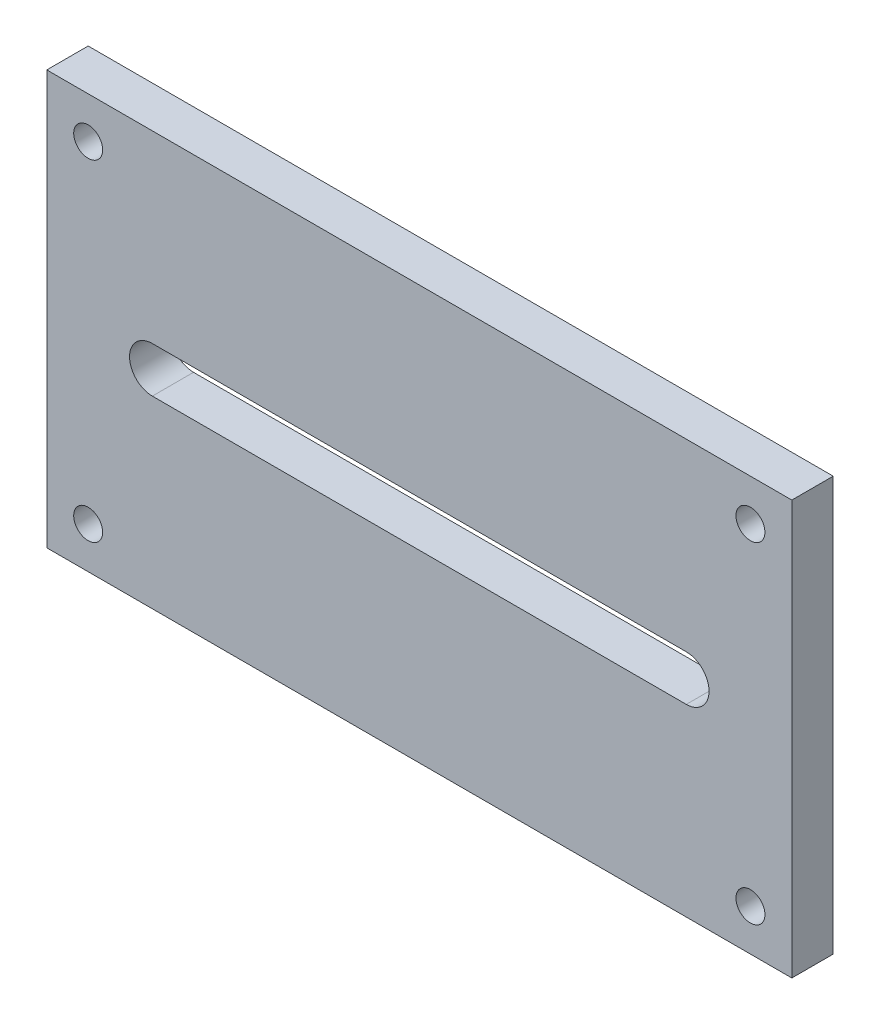
ISO-10303-21;
HEADER;
FILE_DESCRIPTION(('STEP AP214'),'2;1');
FILE_NAME('part.step','',(''),(''),'','','');
FILE_SCHEMA(('AUTOMOTIVE_DESIGN { 1 0 10303 214 1 1 1 1 }'));
ENDSEC;
DATA;
#1=APPLICATION_CONTEXT('core data for automotive mechanical design processes');
#2=APPLICATION_PROTOCOL_DEFINITION('international standard','automotive_design',2000,#1);
#3=PRODUCT_CONTEXT('',#1,'mechanical');
#4=PRODUCT('Part','Part','',(#3));
#5=PRODUCT_RELATED_PRODUCT_CATEGORY('part','',(#4));
#6=PRODUCT_DEFINITION_FORMATION('','',#4);
#7=PRODUCT_DEFINITION_CONTEXT('part definition',#1,'design');
#8=PRODUCT_DEFINITION('design','',#6,#7);
#9=PRODUCT_DEFINITION_SHAPE('','',#8);
#10=(LENGTH_UNIT() NAMED_UNIT(*) SI_UNIT(.MILLI.,.METRE.));
#11=(NAMED_UNIT(*) PLANE_ANGLE_UNIT() SI_UNIT($,.RADIAN.));
#12=(NAMED_UNIT(*) SI_UNIT($,.STERADIAN.) SOLID_ANGLE_UNIT());
#13=UNCERTAINTY_MEASURE_WITH_UNIT(LENGTH_MEASURE(1.E-05),#10,'distance_accuracy_value','');
#14=(GEOMETRIC_REPRESENTATION_CONTEXT(3) GLOBAL_UNCERTAINTY_ASSIGNED_CONTEXT((#13)) GLOBAL_UNIT_ASSIGNED_CONTEXT((#10,
#11,#12)) REPRESENTATION_CONTEXT('',''));
#15=CARTESIAN_POINT('',(0.,0.,0.));
#16=DIRECTION('',(0.,0.,1.));
#17=DIRECTION('',(1.,0.,0.));
#18=AXIS2_PLACEMENT_3D('',#15,#16,#17);
#19=CARTESIAN_POINT('',(45.,25.,5.));
#20=DIRECTION('',(-1.,0.,0.));
#21=DIRECTION('',(0.,-1.,0.));
#22=AXIS2_PLACEMENT_3D('',#19,#20,#21);
#23=PLANE('',#22);
#24=DIRECTION('',(0.,1.,0.));
#25=VECTOR('',#24,1.);
#26=CARTESIAN_POINT('',(45.,25.,0.));
#27=LINE('',#26,#25);
#28=CARTESIAN_POINT('',(45.,-25.,0.));
#29=VERTEX_POINT('',#28);
#30=CARTESIAN_POINT('',(45.,25.,0.));
#31=VERTEX_POINT('',#30);
#32=EDGE_CURVE('E262',#29,#31,#27,.T.);
#33=ORIENTED_EDGE('',*,*,#32,.T.);
#34=DIRECTION('',(0.,0.,-1.));
#35=VECTOR('',#34,1.);
#36=CARTESIAN_POINT('',(45.,25.,5.));
#37=LINE('',#36,#35);
#38=CARTESIAN_POINT('',(45.,25.,5.));
#39=VERTEX_POINT('',#38);
#40=EDGE_CURVE('E13',#39,#31,#37,.T.);
#41=ORIENTED_EDGE('',*,*,#40,.F.);
#42=DIRECTION('',(0.,1.,0.));
#43=VECTOR('',#42,1.);
#44=CARTESIAN_POINT('',(45.,25.,5.));
#45=LINE('',#44,#43);
#46=CARTESIAN_POINT('',(45.,-25.,5.));
#47=VERTEX_POINT('',#46);
#48=EDGE_CURVE('E263',#47,#39,#45,.T.);
#49=ORIENTED_EDGE('',*,*,#48,.F.);
#50=DIRECTION('',(0.,0.,-1.));
#51=VECTOR('',#50,1.);
#52=CARTESIAN_POINT('',(45.,-25.,5.));
#53=LINE('',#52,#51);
#54=EDGE_CURVE('E277',#47,#29,#53,.T.);
#55=ORIENTED_EDGE('',*,*,#54,.T.);
#56=EDGE_LOOP('',(#33,#41,#49,#55));
#57=FACE_BOUND('',#56,.T.);
#58=ADVANCED_FACE('F119',(#57),#23,.F.);
#59=CARTESIAN_POINT('',(-45.,25.,5.));
#60=DIRECTION('',(0.,-1.,0.));
#61=DIRECTION('',(0.,0.,-1.));
#62=AXIS2_PLACEMENT_3D('',#59,#60,#61);
#63=PLANE('',#62);
#64=DIRECTION('',(-1.,0.,0.));
#65=VECTOR('',#64,1.);
#66=CARTESIAN_POINT('',(-45.,25.,0.));
#67=LINE('',#66,#65);
#68=CARTESIAN_POINT('',(-45.,25.,0.));
#69=VERTEX_POINT('',#68);
#70=EDGE_CURVE('E281',#31,#69,#67,.T.);
#71=ORIENTED_EDGE('',*,*,#70,.T.);
#72=DIRECTION('',(0.,0.,-1.));
#73=VECTOR('',#72,1.);
#74=CARTESIAN_POINT('',(-45.,25.,5.));
#75=LINE('',#74,#73);
#76=CARTESIAN_POINT('',(-45.,25.,5.));
#77=VERTEX_POINT('',#76);
#78=EDGE_CURVE('E127',#77,#69,#75,.T.);
#79=ORIENTED_EDGE('',*,*,#78,.F.);
#80=DIRECTION('',(-1.,0.,0.));
#81=VECTOR('',#80,1.);
#82=CARTESIAN_POINT('',(-45.,25.,5.));
#83=LINE('',#82,#81);
#84=EDGE_CURVE('E267',#39,#77,#83,.T.);
#85=ORIENTED_EDGE('',*,*,#84,.F.);
#86=ORIENTED_EDGE('',*,*,#40,.T.);
#87=EDGE_LOOP('',(#71,#79,#85,#86));
#88=FACE_BOUND('',#87,.T.);
#89=ADVANCED_FACE('F317',(#88),#63,.F.);
#90=CARTESIAN_POINT('',(-45.,25.,5.));
#91=DIRECTION('',(1.,0.,0.));
#92=DIRECTION('',(0.,1.,0.));
#93=AXIS2_PLACEMENT_3D('',#90,#91,#92);
#94=PLANE('',#93);
#95=DIRECTION('',(0.,-1.,0.));
#96=VECTOR('',#95,1.);
#97=CARTESIAN_POINT('',(-45.,25.,0.));
#98=LINE('',#97,#96);
#99=CARTESIAN_POINT('',(-45.,-25.,0.));
#100=VERTEX_POINT('',#99);
#101=EDGE_CURVE('E284',#69,#100,#98,.T.);
#102=ORIENTED_EDGE('',*,*,#101,.T.);
#103=DIRECTION('',(0.,0.,-1.));
#104=VECTOR('',#103,1.);
#105=CARTESIAN_POINT('',(-45.,-25.,5.));
#106=LINE('',#105,#104);
#107=CARTESIAN_POINT('',(-45.,-25.,5.));
#108=VERTEX_POINT('',#107);
#109=EDGE_CURVE('E292',#108,#100,#106,.T.);
#110=ORIENTED_EDGE('',*,*,#109,.F.);
#111=DIRECTION('',(0.,-1.,0.));
#112=VECTOR('',#111,1.);
#113=CARTESIAN_POINT('',(-45.,25.,5.));
#114=LINE('',#113,#112);
#115=EDGE_CURVE('E271',#77,#108,#114,.T.);
#116=ORIENTED_EDGE('',*,*,#115,.F.);
#117=ORIENTED_EDGE('',*,*,#78,.T.);
#118=EDGE_LOOP('',(#102,#110,#116,#117));
#119=FACE_BOUND('',#118,.T.);
#120=ADVANCED_FACE('F301',(#119),#94,.F.);
#121=CARTESIAN_POINT('',(-45.,-25.,5.));
#122=DIRECTION('',(0.,1.,0.));
#123=DIRECTION('',(0.,0.,1.));
#124=AXIS2_PLACEMENT_3D('',#121,#122,#123);
#125=PLANE('',#124);
#126=DIRECTION('',(1.,0.,0.));
#127=VECTOR('',#126,1.);
#128=CARTESIAN_POINT('',(-45.,-25.,0.));
#129=LINE('',#128,#127);
#130=EDGE_CURVE('E268',#100,#29,#129,.T.);
#131=ORIENTED_EDGE('',*,*,#130,.T.);
#132=ORIENTED_EDGE('',*,*,#54,.F.);
#133=DIRECTION('',(1.,0.,0.));
#134=VECTOR('',#133,1.);
#135=CARTESIAN_POINT('',(-45.,-25.,5.));
#136=LINE('',#135,#134);
#137=EDGE_CURVE('E274',#108,#47,#136,.T.);
#138=ORIENTED_EDGE('',*,*,#137,.F.);
#139=ORIENTED_EDGE('',*,*,#109,.T.);
#140=EDGE_LOOP('',(#131,#132,#138,#139));
#141=FACE_BOUND('',#140,.T.);
#142=ADVANCED_FACE('F310',(#141),#125,.F.);
#143=CARTESIAN_POINT('',(0.,0.,5.));
#144=DIRECTION('',(0.,0.,1.));
#145=DIRECTION('',(1.,0.,0.));
#146=AXIS2_PLACEMENT_3D('',#143,#144,#145);
#147=PLANE('',#146);
#148=CARTESIAN_POINT('',(40.,20.,5.));
#149=DIRECTION('',(0.,0.,-1.));
#150=DIRECTION('',(-1.,0.,0.));
#151=AXIS2_PLACEMENT_3D('',#148,#149,#150);
#152=CIRCLE('',#151,1.75);
#153=CARTESIAN_POINT('',(38.25,20.,5.));
#154=VERTEX_POINT('',#153);
#155=EDGE_CURVE('E399',#154,#154,#152,.T.);
#156=ORIENTED_EDGE('',*,*,#155,.T.);
#157=EDGE_LOOP('',(#156));
#158=FACE_BOUND('',#157,.T.);
#159=CARTESIAN_POINT('',(-40.,20.,5.));
#160=DIRECTION('',(0.,0.,-1.));
#161=DIRECTION('',(-1.,0.,0.));
#162=AXIS2_PLACEMENT_3D('',#159,#160,#161);
#163=CIRCLE('',#162,1.75);
#164=CARTESIAN_POINT('',(-41.75,20.,5.));
#165=VERTEX_POINT('',#164);
#166=EDGE_CURVE('E413',#165,#165,#163,.T.);
#167=ORIENTED_EDGE('',*,*,#166,.T.);
#168=EDGE_LOOP('',(#167));
#169=FACE_BOUND('',#168,.T.);
#170=CARTESIAN_POINT('',(-40.,-20.,5.));
#171=DIRECTION('',(0.,0.,-1.));
#172=DIRECTION('',(-1.,0.,0.));
#173=AXIS2_PLACEMENT_3D('',#170,#171,#172);
#174=CIRCLE('',#173,1.75);
#175=CARTESIAN_POINT('',(-41.75,-20.,5.));
#176=VERTEX_POINT('',#175);
#177=EDGE_CURVE('E425',#176,#176,#174,.T.);
#178=ORIENTED_EDGE('',*,*,#177,.T.);
#179=EDGE_LOOP('',(#178));
#180=FACE_BOUND('',#179,.T.);
#181=CARTESIAN_POINT('',(40.,-20.,5.));
#182=DIRECTION('',(0.,0.,-1.));
#183=DIRECTION('',(-1.,0.,0.));
#184=AXIS2_PLACEMENT_3D('',#181,#182,#183);
#185=CIRCLE('',#184,1.75);
#186=CARTESIAN_POINT('',(38.25,-20.,5.));
#187=VERTEX_POINT('',#186);
#188=EDGE_CURVE('E437',#187,#187,#185,.T.);
#189=ORIENTED_EDGE('',*,*,#188,.T.);
#190=EDGE_LOOP('',(#189));
#191=FACE_BOUND('',#190,.T.);
#192=DIRECTION('',(1.,0.,0.));
#193=VECTOR('',#192,1.);
#194=CARTESIAN_POINT('',(-32.25,-2.75,5.));
#195=LINE('',#194,#193);
#196=CARTESIAN_POINT('',(-32.25,-2.75,5.));
#197=VERTEX_POINT('',#196);
#198=CARTESIAN_POINT('',(32.25,-2.75,5.));
#199=VERTEX_POINT('',#198);
#200=EDGE_CURVE('E206',#197,#199,#195,.T.);
#201=ORIENTED_EDGE('',*,*,#200,.F.);
#202=CARTESIAN_POINT('',(-32.25,0.,5.));
#203=DIRECTION('',(0.,0.,-1.));
#204=DIRECTION('',(-1.,0.,0.));
#205=AXIS2_PLACEMENT_3D('',#202,#203,#204);
#206=CIRCLE('',#205,2.75);
#207=CARTESIAN_POINT('',(-32.25,2.75,5.));
#208=VERTEX_POINT('',#207);
#209=EDGE_CURVE('E214',#197,#208,#206,.T.);
#210=ORIENTED_EDGE('',*,*,#209,.T.);
#211=DIRECTION('',(1.,0.,0.));
#212=VECTOR('',#211,1.);
#213=CARTESIAN_POINT('',(-32.25,2.75,5.));
#214=LINE('',#213,#212);
#215=CARTESIAN_POINT('',(32.25,2.75,5.));
#216=VERTEX_POINT('',#215);
#217=EDGE_CURVE('E448',#208,#216,#214,.T.);
#218=ORIENTED_EDGE('',*,*,#217,.T.);
#219=CARTESIAN_POINT('',(32.25,0.,5.));
#220=DIRECTION('',(0.,0.,-1.));
#221=DIRECTION('',(-1.,0.,0.));
#222=AXIS2_PLACEMENT_3D('',#219,#220,#221);
#223=CIRCLE('',#222,2.75);
#224=EDGE_CURVE('E251',#216,#199,#223,.T.);
#225=ORIENTED_EDGE('',*,*,#224,.T.);
#226=EDGE_LOOP('',(#201,#210,#218,#225));
#227=FACE_BOUND('',#226,.T.);
#228=ORIENTED_EDGE('',*,*,#48,.T.);
#229=ORIENTED_EDGE('',*,*,#84,.T.);
#230=ORIENTED_EDGE('',*,*,#115,.T.);
#231=ORIENTED_EDGE('',*,*,#137,.T.);
#232=EDGE_LOOP('',(#228,#229,#230,#231));
#233=FACE_BOUND('',#232,.T.);
#234=ADVANCED_FACE('F316',(#158,#169,#180,#191,#227,#233),#147,.T.);
#235=CARTESIAN_POINT('',(0.,0.,0.));
#236=DIRECTION('',(0.,0.,1.));
#237=DIRECTION('',(1.,0.,0.));
#238=AXIS2_PLACEMENT_3D('',#235,#236,#237);
#239=PLANE('',#238);
#240=CARTESIAN_POINT('',(40.,20.,0.));
#241=DIRECTION('',(0.,0.,-1.));
#242=DIRECTION('',(-1.,0.,0.));
#243=AXIS2_PLACEMENT_3D('',#240,#241,#242);
#244=CIRCLE('',#243,1.775);
#245=CARTESIAN_POINT('',(38.225,20.,0.));
#246=VERTEX_POINT('',#245);
#247=EDGE_CURVE('E395',#246,#246,#244,.T.);
#248=ORIENTED_EDGE('',*,*,#247,.F.);
#249=EDGE_LOOP('',(#248));
#250=FACE_BOUND('',#249,.T.);
#251=CARTESIAN_POINT('',(-40.,20.,0.));
#252=DIRECTION('',(0.,0.,-1.));
#253=DIRECTION('',(-1.,0.,0.));
#254=AXIS2_PLACEMENT_3D('',#251,#252,#253);
#255=CIRCLE('',#254,1.775);
#256=CARTESIAN_POINT('',(-41.775,20.,0.));
#257=VERTEX_POINT('',#256);
#258=EDGE_CURVE('E405',#257,#257,#255,.T.);
#259=ORIENTED_EDGE('',*,*,#258,.F.);
#260=EDGE_LOOP('',(#259));
#261=FACE_BOUND('',#260,.T.);
#262=CARTESIAN_POINT('',(-40.,-20.,0.));
#263=DIRECTION('',(0.,0.,-1.));
#264=DIRECTION('',(-1.,0.,0.));
#265=AXIS2_PLACEMENT_3D('',#262,#263,#264);
#266=CIRCLE('',#265,1.775);
#267=CARTESIAN_POINT('',(-41.775,-20.,0.));
#268=VERTEX_POINT('',#267);
#269=EDGE_CURVE('E417',#268,#268,#266,.T.);
#270=ORIENTED_EDGE('',*,*,#269,.F.);
#271=EDGE_LOOP('',(#270));
#272=FACE_BOUND('',#271,.T.);
#273=CARTESIAN_POINT('',(40.,-20.,0.));
#274=DIRECTION('',(0.,0.,-1.));
#275=DIRECTION('',(-1.,0.,0.));
#276=AXIS2_PLACEMENT_3D('',#273,#274,#275);
#277=CIRCLE('',#276,1.775);
#278=CARTESIAN_POINT('',(38.225,-20.,0.));
#279=VERTEX_POINT('',#278);
#280=EDGE_CURVE('E429',#279,#279,#277,.T.);
#281=ORIENTED_EDGE('',*,*,#280,.F.);
#282=EDGE_LOOP('',(#281));
#283=FACE_BOUND('',#282,.T.);
#284=DIRECTION('',(1.,0.,0.));
#285=VECTOR('',#284,1.);
#286=CARTESIAN_POINT('',(-32.25,-2.775,0.));
#287=LINE('',#286,#285);
#288=CARTESIAN_POINT('',(-32.25,-2.775,0.));
#289=VERTEX_POINT('',#288);
#290=CARTESIAN_POINT('',(32.25,-2.775,0.));
#291=VERTEX_POINT('',#290);
#292=EDGE_CURVE('E205',#289,#291,#287,.T.);
#293=ORIENTED_EDGE('',*,*,#292,.T.);
#294=CARTESIAN_POINT('',(32.25,0.,0.));
#295=DIRECTION('',(0.,0.,-1.));
#296=DIRECTION('',(-1.,0.,0.));
#297=AXIS2_PLACEMENT_3D('',#294,#295,#296);
#298=CIRCLE('',#297,2.775);
#299=CARTESIAN_POINT('',(32.25,2.77500000000003,0.));
#300=VERTEX_POINT('',#299);
#301=EDGE_CURVE('E244',#300,#291,#298,.T.);
#302=ORIENTED_EDGE('',*,*,#301,.F.);
#303=DIRECTION('',(1.,0.,0.));
#304=VECTOR('',#303,1.);
#305=CARTESIAN_POINT('',(-32.25,2.77500000000003,0.));
#306=LINE('',#305,#304);
#307=CARTESIAN_POINT('',(-32.25,2.775,0.));
#308=VERTEX_POINT('',#307);
#309=EDGE_CURVE('E441',#308,#300,#306,.T.);
#310=ORIENTED_EDGE('',*,*,#309,.F.);
#311=CARTESIAN_POINT('',(-32.25,0.,0.));
#312=DIRECTION('',(0.,0.,-1.));
#313=DIRECTION('',(-1.,0.,0.));
#314=AXIS2_PLACEMENT_3D('',#311,#312,#313);
#315=CIRCLE('',#314,2.775);
#316=EDGE_CURVE('E217',#289,#308,#315,.T.);
#317=ORIENTED_EDGE('',*,*,#316,.F.);
#318=EDGE_LOOP('',(#293,#302,#310,#317));
#319=FACE_BOUND('',#318,.T.);
#320=ORIENTED_EDGE('',*,*,#32,.F.);
#321=ORIENTED_EDGE('',*,*,#130,.F.);
#322=ORIENTED_EDGE('',*,*,#101,.F.);
#323=ORIENTED_EDGE('',*,*,#70,.F.);
#324=EDGE_LOOP('',(#320,#321,#322,#323));
#325=FACE_BOUND('',#324,.T.);
#326=ADVANCED_FACE('F307',(#250,#261,#272,#283,#319,#325),#239,.F.);
#327=CARTESIAN_POINT('',(32.25,0.,0.));
#328=DIRECTION('',(0.,0.,-1.));
#329=DIRECTION('',(-1.,0.,0.));
#330=AXIS2_PLACEMENT_3D('',#327,#328,#329);
#331=CYLINDRICAL_SURFACE('',#330,2.75);
#332=ORIENTED_EDGE('',*,*,#224,.F.);
#333=DIRECTION('',(0.,0.,-1.));
#334=VECTOR('',#333,1.);
#335=CARTESIAN_POINT('',(32.25,2.75,0.));
#336=LINE('',#335,#334);
#337=CARTESIAN_POINT('',(32.25,2.75,0.0250000000000014));
#338=VERTEX_POINT('',#337);
#339=EDGE_CURVE('E240',#338,#216,#336,.F.);
#340=ORIENTED_EDGE('',*,*,#339,.F.);
#341=CARTESIAN_POINT('',(32.25,0.,0.0250000000000014));
#342=DIRECTION('',(0.,0.,-1.));
#343=DIRECTION('',(-1.,0.,0.));
#344=AXIS2_PLACEMENT_3D('',#341,#342,#343);
#345=CIRCLE('',#344,2.75);
#346=CARTESIAN_POINT('',(32.25,-2.75,0.0250000000000011));
#347=VERTEX_POINT('',#346);
#348=EDGE_CURVE('E248',#338,#347,#345,.T.);
#349=ORIENTED_EDGE('',*,*,#348,.T.);
#350=DIRECTION('',(0.,0.,-1.));
#351=VECTOR('',#350,1.);
#352=CARTESIAN_POINT('',(32.25,-2.75,0.));
#353=LINE('',#352,#351);
#354=EDGE_CURVE('E134',#199,#347,#353,.T.);
#355=ORIENTED_EDGE('',*,*,#354,.F.);
#356=EDGE_LOOP('',(#332,#340,#349,#355));
#357=FACE_BOUND('',#356,.T.);
#358=ADVANCED_FACE('F329',(#357),#331,.F.);
#359=CARTESIAN_POINT('',(32.25,0.,0.));
#360=DIRECTION('',(0.,0.,-1.));
#361=DIRECTION('',(-1.,0.,0.));
#362=AXIS2_PLACEMENT_3D('',#359,#360,#361);
#363=CONICAL_SURFACE('',#362,2.775,0.785398163397427);
#364=ORIENTED_EDGE('',*,*,#348,.F.);
#365=DIRECTION('',(0.,0.707106781186532,-0.707106781186563));
#366=VECTOR('',#365,1.);
#367=CARTESIAN_POINT('',(32.25,0.,2.77500000000012));
#368=LINE('',#367,#366);
#369=EDGE_CURVE('E258',#300,#338,#368,.F.);
#370=ORIENTED_EDGE('',*,*,#369,.F.);
#371=ORIENTED_EDGE('',*,*,#301,.T.);
#372=DIRECTION('',(0.,0.707106781186532,0.707106781186563));
#373=VECTOR('',#372,1.);
#374=CARTESIAN_POINT('',(32.25,0.,2.77500000000012));
#375=LINE('',#374,#373);
#376=EDGE_CURVE('E255',#347,#291,#375,.F.);
#377=ORIENTED_EDGE('',*,*,#376,.F.);
#378=EDGE_LOOP('',(#364,#370,#371,#377));
#379=FACE_BOUND('',#378,.T.);
#380=ADVANCED_FACE('F336',(#379),#363,.F.);
#381=CARTESIAN_POINT('',(-32.25,0.,0.));
#382=DIRECTION('',(0.,0.,-1.));
#383=DIRECTION('',(-1.,0.,0.));
#384=AXIS2_PLACEMENT_3D('',#381,#382,#383);
#385=CYLINDRICAL_SURFACE('',#384,2.75);
#386=CARTESIAN_POINT('',(-32.25,0.,0.0250000000000014));
#387=DIRECTION('',(0.,0.,-1.));
#388=DIRECTION('',(-1.,0.,0.));
#389=AXIS2_PLACEMENT_3D('',#386,#387,#388);
#390=CIRCLE('',#389,2.75);
#391=CARTESIAN_POINT('',(-32.25,-2.75,0.0250000000000011));
#392=VERTEX_POINT('',#391);
#393=CARTESIAN_POINT('',(-32.25,2.75,0.0250000000000014));
#394=VERTEX_POINT('',#393);
#395=EDGE_CURVE('E212',#392,#394,#390,.T.);
#396=ORIENTED_EDGE('',*,*,#395,.T.);
#397=DIRECTION('',(0.,0.,-1.));
#398=VECTOR('',#397,1.);
#399=CARTESIAN_POINT('',(-32.25,2.75,0.));
#400=LINE('',#399,#398);
#401=EDGE_CURVE('E218',#208,#394,#400,.T.);
#402=ORIENTED_EDGE('',*,*,#401,.F.);
#403=ORIENTED_EDGE('',*,*,#209,.F.);
#404=DIRECTION('',(0.,0.,-1.));
#405=VECTOR('',#404,1.);
#406=CARTESIAN_POINT('',(-32.25,-2.75,0.));
#407=LINE('',#406,#405);
#408=EDGE_CURVE('E200',#392,#197,#407,.F.);
#409=ORIENTED_EDGE('',*,*,#408,.F.);
#410=EDGE_LOOP('',(#396,#402,#403,#409));
#411=FACE_BOUND('',#410,.T.);
#412=ADVANCED_FACE('F210',(#411),#385,.F.);
#413=CARTESIAN_POINT('',(-32.25,0.,0.));
#414=DIRECTION('',(0.,0.,-1.));
#415=DIRECTION('',(-1.,0.,0.));
#416=AXIS2_PLACEMENT_3D('',#413,#414,#415);
#417=CONICAL_SURFACE('',#416,2.775,0.785398163397427);
#418=ORIENTED_EDGE('',*,*,#316,.T.);
#419=DIRECTION('',(0.,-0.707106781186532,0.707106781186563));
#420=VECTOR('',#419,1.);
#421=CARTESIAN_POINT('',(-32.25,0.,2.77500000000012));
#422=LINE('',#421,#420);
#423=EDGE_CURVE('E224',#394,#308,#422,.F.);
#424=ORIENTED_EDGE('',*,*,#423,.F.);
#425=ORIENTED_EDGE('',*,*,#395,.F.);
#426=DIRECTION('',(0.,-0.707106781186532,-0.707106781186563));
#427=VECTOR('',#426,1.);
#428=CARTESIAN_POINT('',(-32.25,0.,2.77500000000012));
#429=LINE('',#428,#427);
#430=EDGE_CURVE('E142',#289,#392,#429,.F.);
#431=ORIENTED_EDGE('',*,*,#430,.F.);
#432=EDGE_LOOP('',(#418,#424,#425,#431));
#433=FACE_BOUND('',#432,.T.);
#434=ADVANCED_FACE('F227',(#433),#417,.F.);
#435=CARTESIAN_POINT('',(-32.25,0.,2.77500000000012));
#436=DIRECTION('',(0.,-0.707106781186563,0.707106781186532));
#437=DIRECTION('',(0.,-0.707106781186532,-0.707106781186563));
#438=AXIS2_PLACEMENT_3D('',#435,#436,#437);
#439=PLANE('',#438);
#440=ORIENTED_EDGE('',*,*,#376,.T.);
#441=ORIENTED_EDGE('',*,*,#292,.F.);
#442=ORIENTED_EDGE('',*,*,#430,.T.);
#443=DIRECTION('',(1.,0.,0.));
#444=VECTOR('',#443,1.);
#445=CARTESIAN_POINT('',(-32.25,-2.75,0.0250000000000011));
#446=LINE('',#445,#444);
#447=EDGE_CURVE('E197',#392,#347,#446,.T.);
#448=ORIENTED_EDGE('',*,*,#447,.T.);
#449=EDGE_LOOP('',(#440,#441,#442,#448));
#450=FACE_BOUND('',#449,.T.);
#451=ADVANCED_FACE('F220',(#450),#439,.F.);
#452=CARTESIAN_POINT('',(-32.25,-2.75,0.));
#453=DIRECTION('',(0.,-1.,0.));
#454=DIRECTION('',(0.,0.,-1.));
#455=AXIS2_PLACEMENT_3D('',#452,#453,#454);
#456=PLANE('',#455);
#457=ORIENTED_EDGE('',*,*,#354,.T.);
#458=ORIENTED_EDGE('',*,*,#447,.F.);
#459=ORIENTED_EDGE('',*,*,#408,.T.);
#460=ORIENTED_EDGE('',*,*,#200,.T.);
#461=EDGE_LOOP('',(#457,#458,#459,#460));
#462=FACE_BOUND('',#461,.T.);
#463=ADVANCED_FACE('F199',(#462),#456,.F.);
#464=CARTESIAN_POINT('',(-32.25,2.75,0.));
#465=DIRECTION('',(0.,1.,0.));
#466=DIRECTION('',(0.,0.,1.));
#467=AXIS2_PLACEMENT_3D('',#464,#465,#466);
#468=PLANE('',#467);
#469=ORIENTED_EDGE('',*,*,#339,.T.);
#470=ORIENTED_EDGE('',*,*,#217,.F.);
#471=ORIENTED_EDGE('',*,*,#401,.T.);
#472=DIRECTION('',(1.,0.,0.));
#473=VECTOR('',#472,1.);
#474=CARTESIAN_POINT('',(-32.25,2.75,0.0250000000000014));
#475=LINE('',#474,#473);
#476=EDGE_CURVE('E444',#394,#338,#475,.T.);
#477=ORIENTED_EDGE('',*,*,#476,.T.);
#478=EDGE_LOOP('',(#469,#470,#471,#477));
#479=FACE_BOUND('',#478,.T.);
#480=ADVANCED_FACE('F348',(#479),#468,.F.);
#481=CARTESIAN_POINT('',(-32.25,0.,2.77500000000012));
#482=DIRECTION('',(0.,0.707106781186563,0.707106781186532));
#483=DIRECTION('',(0.,-0.707106781186532,0.707106781186563));
#484=AXIS2_PLACEMENT_3D('',#481,#482,#483);
#485=PLANE('',#484);
#486=ORIENTED_EDGE('',*,*,#369,.T.);
#487=ORIENTED_EDGE('',*,*,#476,.F.);
#488=ORIENTED_EDGE('',*,*,#423,.T.);
#489=ORIENTED_EDGE('',*,*,#309,.T.);
#490=EDGE_LOOP('',(#486,#487,#488,#489));
#491=FACE_BOUND('',#490,.T.);
#492=ADVANCED_FACE('F351',(#491),#485,.F.);
#493=CARTESIAN_POINT('',(40.,-20.,0.));
#494=DIRECTION('',(0.,0.,-1.));
#495=DIRECTION('',(-1.,0.,0.));
#496=AXIS2_PLACEMENT_3D('',#493,#494,#495);
#497=CYLINDRICAL_SURFACE('',#496,1.75);
#498=ORIENTED_EDGE('',*,*,#188,.F.);
#499=EDGE_LOOP('',(#498));
#500=FACE_BOUND('',#499,.T.);
#501=CARTESIAN_POINT('',(40.,-20.,0.0250000000000003));
#502=DIRECTION('',(0.,0.,-1.));
#503=DIRECTION('',(-1.,0.,0.));
#504=AXIS2_PLACEMENT_3D('',#501,#502,#503);
#505=CIRCLE('',#504,1.75);
#506=CARTESIAN_POINT('',(38.25,-20.,0.0250000000000003));
#507=VERTEX_POINT('',#506);
#508=EDGE_CURVE('E433',#507,#507,#505,.T.);
#509=ORIENTED_EDGE('',*,*,#508,.T.);
#510=EDGE_LOOP('',(#509));
#511=FACE_BOUND('',#510,.T.);
#512=ADVANCED_FACE('F355',(#500,#511),#497,.F.);
#513=CARTESIAN_POINT('',(40.,-20.,0.));
#514=DIRECTION('',(0.,0.,-1.));
#515=DIRECTION('',(-1.,0.,0.));
#516=AXIS2_PLACEMENT_3D('',#513,#514,#515);
#517=CONICAL_SURFACE('',#516,1.775,0.785398163397388);
#518=ORIENTED_EDGE('',*,*,#508,.F.);
#519=EDGE_LOOP('',(#518));
#520=FACE_BOUND('',#519,.T.);
#521=ORIENTED_EDGE('',*,*,#280,.T.);
#522=EDGE_LOOP('',(#521));
#523=FACE_BOUND('',#522,.T.);
#524=ADVANCED_FACE('F359',(#520,#523),#517,.F.);
#525=CARTESIAN_POINT('',(-40.,-20.,0.));
#526=DIRECTION('',(0.,0.,-1.));
#527=DIRECTION('',(-1.,0.,0.));
#528=AXIS2_PLACEMENT_3D('',#525,#526,#527);
#529=CYLINDRICAL_SURFACE('',#528,1.75);
#530=ORIENTED_EDGE('',*,*,#177,.F.);
#531=EDGE_LOOP('',(#530));
#532=FACE_BOUND('',#531,.T.);
#533=CARTESIAN_POINT('',(-40.,-20.,0.0250000000000003));
#534=DIRECTION('',(0.,0.,-1.));
#535=DIRECTION('',(-1.,0.,0.));
#536=AXIS2_PLACEMENT_3D('',#533,#534,#535);
#537=CIRCLE('',#536,1.75);
#538=CARTESIAN_POINT('',(-41.75,-20.,0.0250000000000003));
#539=VERTEX_POINT('',#538);
#540=EDGE_CURVE('E421',#539,#539,#537,.T.);
#541=ORIENTED_EDGE('',*,*,#540,.T.);
#542=EDGE_LOOP('',(#541));
#543=FACE_BOUND('',#542,.T.);
#544=ADVANCED_FACE('F363',(#532,#543),#529,.F.);
#545=CARTESIAN_POINT('',(-40.,-20.,0.));
#546=DIRECTION('',(0.,0.,-1.));
#547=DIRECTION('',(-1.,0.,0.));
#548=AXIS2_PLACEMENT_3D('',#545,#546,#547);
#549=CONICAL_SURFACE('',#548,1.775,0.785398163397388);
#550=ORIENTED_EDGE('',*,*,#540,.F.);
#551=EDGE_LOOP('',(#550));
#552=FACE_BOUND('',#551,.T.);
#553=ORIENTED_EDGE('',*,*,#269,.T.);
#554=EDGE_LOOP('',(#553));
#555=FACE_BOUND('',#554,.T.);
#556=ADVANCED_FACE('F367',(#552,#555),#549,.F.);
#557=CARTESIAN_POINT('',(-40.,20.,0.));
#558=DIRECTION('',(0.,0.,-1.));
#559=DIRECTION('',(-1.,0.,0.));
#560=AXIS2_PLACEMENT_3D('',#557,#558,#559);
#561=CYLINDRICAL_SURFACE('',#560,1.75);
#562=ORIENTED_EDGE('',*,*,#166,.F.);
#563=EDGE_LOOP('',(#562));
#564=FACE_BOUND('',#563,.T.);
#565=CARTESIAN_POINT('',(-40.,20.,0.0250000000000003));
#566=DIRECTION('',(0.,0.,-1.));
#567=DIRECTION('',(-1.,0.,0.));
#568=AXIS2_PLACEMENT_3D('',#565,#566,#567);
#569=CIRCLE('',#568,1.75);
#570=CARTESIAN_POINT('',(-41.75,20.,0.0250000000000003));
#571=VERTEX_POINT('',#570);
#572=EDGE_CURVE('E409',#571,#571,#569,.T.);
#573=ORIENTED_EDGE('',*,*,#572,.T.);
#574=EDGE_LOOP('',(#573));
#575=FACE_BOUND('',#574,.T.);
#576=ADVANCED_FACE('F371',(#564,#575),#561,.F.);
#577=CARTESIAN_POINT('',(-40.,20.,0.));
#578=DIRECTION('',(0.,0.,-1.));
#579=DIRECTION('',(-1.,0.,0.));
#580=AXIS2_PLACEMENT_3D('',#577,#578,#579);
#581=CONICAL_SURFACE('',#580,1.775,0.785398163397388);
#582=ORIENTED_EDGE('',*,*,#572,.F.);
#583=EDGE_LOOP('',(#582));
#584=FACE_BOUND('',#583,.T.);
#585=ORIENTED_EDGE('',*,*,#258,.T.);
#586=EDGE_LOOP('',(#585));
#587=FACE_BOUND('',#586,.T.);
#588=ADVANCED_FACE('F375',(#584,#587),#581,.F.);
#589=CARTESIAN_POINT('',(40.,20.,0.));
#590=DIRECTION('',(0.,0.,-1.));
#591=DIRECTION('',(-1.,0.,0.));
#592=AXIS2_PLACEMENT_3D('',#589,#590,#591);
#593=CYLINDRICAL_SURFACE('',#592,1.75);
#594=ORIENTED_EDGE('',*,*,#155,.F.);
#595=EDGE_LOOP('',(#594));
#596=FACE_BOUND('',#595,.T.);
#597=CARTESIAN_POINT('',(40.,20.,0.0250000000000003));
#598=DIRECTION('',(0.,0.,-1.));
#599=DIRECTION('',(-1.,0.,0.));
#600=AXIS2_PLACEMENT_3D('',#597,#598,#599);
#601=CIRCLE('',#600,1.75);
#602=CARTESIAN_POINT('',(38.25,20.,0.0250000000000003));
#603=VERTEX_POINT('',#602);
#604=EDGE_CURVE('E392',#603,#603,#601,.T.);
#605=ORIENTED_EDGE('',*,*,#604,.T.);
#606=EDGE_LOOP('',(#605));
#607=FACE_BOUND('',#606,.T.);
#608=ADVANCED_FACE('F379',(#596,#607),#593,.F.);
#609=CARTESIAN_POINT('',(40.,20.,0.));
#610=DIRECTION('',(0.,0.,-1.));
#611=DIRECTION('',(-1.,0.,0.));
#612=AXIS2_PLACEMENT_3D('',#609,#610,#611);
#613=CONICAL_SURFACE('',#612,1.775,0.785398163397388);
#614=ORIENTED_EDGE('',*,*,#604,.F.);
#615=EDGE_LOOP('',(#614));
#616=FACE_BOUND('',#615,.T.);
#617=ORIENTED_EDGE('',*,*,#247,.T.);
#618=EDGE_LOOP('',(#617));
#619=FACE_BOUND('',#618,.T.);
#620=ADVANCED_FACE('F383',(#616,#619),#613,.F.);
#621=CLOSED_SHELL('',(#58,#89,#120,#142,#234,#326,#358,#380,#412,#434,#451,#463,#480,#492,#512,
#524,#544,#556,#576,#588,#608,#620));
#622=MANIFOLD_SOLID_BREP('B2',#621);
#623=ADVANCED_BREP_SHAPE_REPRESENTATION('',(#18,#622),#14);
#624=SHAPE_DEFINITION_REPRESENTATION(#9,#623);
ENDSEC;
END-ISO-10303-21;
